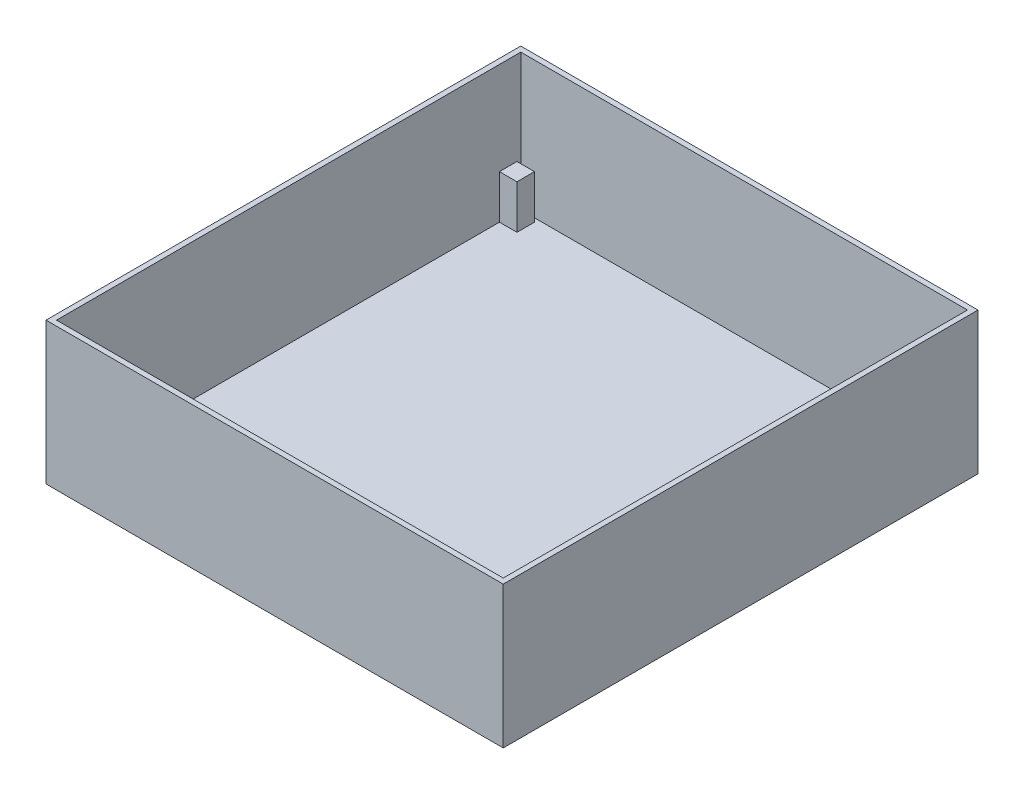
ISO-10303-21;
HEADER;
FILE_DESCRIPTION(('STEP AP214'),'2;1');
FILE_NAME('part.step','',(''),(''),'','','');
FILE_SCHEMA(('AUTOMOTIVE_DESIGN { 1 0 10303 214 1 1 1 1 }'));
ENDSEC;
DATA;
#1=APPLICATION_CONTEXT('core data for automotive mechanical design processes');
#2=APPLICATION_PROTOCOL_DEFINITION('international standard','automotive_design',2000,#1);
#3=PRODUCT_CONTEXT('',#1,'mechanical');
#4=PRODUCT('Part','Part','',(#3));
#5=PRODUCT_RELATED_PRODUCT_CATEGORY('part','',(#4));
#6=PRODUCT_DEFINITION_FORMATION('','',#4);
#7=PRODUCT_DEFINITION_CONTEXT('part definition',#1,'design');
#8=PRODUCT_DEFINITION('design','',#6,#7);
#9=PRODUCT_DEFINITION_SHAPE('','',#8);
#10=(LENGTH_UNIT() NAMED_UNIT(*) SI_UNIT(.MILLI.,.METRE.));
#11=(NAMED_UNIT(*) PLANE_ANGLE_UNIT() SI_UNIT($,.RADIAN.));
#12=(NAMED_UNIT(*) SI_UNIT($,.STERADIAN.) SOLID_ANGLE_UNIT());
#13=UNCERTAINTY_MEASURE_WITH_UNIT(LENGTH_MEASURE(1.E-05),#10,'distance_accuracy_value','');
#14=(GEOMETRIC_REPRESENTATION_CONTEXT(3) GLOBAL_UNCERTAINTY_ASSIGNED_CONTEXT((#13)) GLOBAL_UNIT_ASSIGNED_CONTEXT((#10,
#11,#12)) REPRESENTATION_CONTEXT('',''));
#15=CARTESIAN_POINT('',(0.,0.,0.));
#16=DIRECTION('',(0.,0.,1.));
#17=DIRECTION('',(1.,0.,0.));
#18=AXIS2_PLACEMENT_3D('',#15,#16,#17);
#19=CARTESIAN_POINT('',(0.,1.2,0.));
#20=DIRECTION('',(0.,1.,0.));
#21=DIRECTION('',(0.,0.,1.));
#22=AXIS2_PLACEMENT_3D('',#19,#20,#21);
#23=PLANE('',#22);
#24=DIRECTION('',(0.,0.,-1.));
#25=VECTOR('',#24,1.);
#26=CARTESIAN_POINT('',(-47.,1.2,-52.1305720631582));
#27=LINE('',#26,#25);
#28=CARTESIAN_POINT('',(-47.,1.2,-48.1305720631582));
#29=VERTEX_POINT('',#28);
#30=CARTESIAN_POINT('',(-47.,1.2,-52.1305720631582));
#31=VERTEX_POINT('',#30);
#32=EDGE_CURVE('E571',#29,#31,#27,.T.);
#33=ORIENTED_EDGE('',*,*,#32,.F.);
#34=DIRECTION('',(1.,0.,0.));
#35=VECTOR('',#34,1.);
#36=CARTESIAN_POINT('',(-51.,1.2,-48.1305720631582));
#37=LINE('',#36,#35);
#38=CARTESIAN_POINT('',(-51.,1.2,-48.1305720631582));
#39=VERTEX_POINT('',#38);
#40=EDGE_CURVE('E610',#39,#29,#37,.T.);
#41=ORIENTED_EDGE('',*,*,#40,.F.);
#42=DIRECTION('',(0.,0.,1.));
#43=VECTOR('',#42,1.);
#44=CARTESIAN_POINT('',(-51.,1.2,53.));
#45=LINE('',#44,#43);
#46=CARTESIAN_POINT('',(-51.,1.2,49.));
#47=VERTEX_POINT('',#46);
#48=EDGE_CURVE('E204',#39,#47,#45,.T.);
#49=ORIENTED_EDGE('',*,*,#48,.T.);
#50=DIRECTION('',(-1.,0.,0.));
#51=VECTOR('',#50,1.);
#52=CARTESIAN_POINT('',(-51.,1.2,49.));
#53=LINE('',#52,#51);
#54=CARTESIAN_POINT('',(-47.,1.2,49.));
#55=VERTEX_POINT('',#54);
#56=EDGE_CURVE('E62',#55,#47,#53,.T.);
#57=ORIENTED_EDGE('',*,*,#56,.F.);
#58=DIRECTION('',(0.,0.,-1.));
#59=VECTOR('',#58,1.);
#60=CARTESIAN_POINT('',(-47.,1.2,53.));
#61=LINE('',#60,#59);
#62=CARTESIAN_POINT('',(-47.,1.2,53.));
#63=VERTEX_POINT('',#62);
#64=EDGE_CURVE('E205',#63,#55,#61,.T.);
#65=ORIENTED_EDGE('',*,*,#64,.F.);
#66=DIRECTION('',(1.,0.,0.));
#67=VECTOR('',#66,1.);
#68=CARTESIAN_POINT('',(51.,1.2,53.));
#69=LINE('',#68,#67);
#70=CARTESIAN_POINT('',(48.,1.2,53.));
#71=VERTEX_POINT('',#70);
#72=EDGE_CURVE('E278',#63,#71,#69,.T.);
#73=ORIENTED_EDGE('',*,*,#72,.T.);
#74=DIRECTION('',(0.,0.,-1.));
#75=VECTOR('',#74,1.);
#76=CARTESIAN_POINT('',(48.,1.2,0.));
#77=LINE('',#76,#75);
#78=CARTESIAN_POINT('',(48.,1.2,50.));
#79=VERTEX_POINT('',#78);
#80=EDGE_CURVE('E252',#71,#79,#77,.T.);
#81=ORIENTED_EDGE('',*,*,#80,.T.);
#82=DIRECTION('',(-1.,0.,0.));
#83=VECTOR('',#82,1.);
#84=CARTESIAN_POINT('',(0.,1.2,50.));
#85=LINE('',#84,#83);
#86=CARTESIAN_POINT('',(51.,1.2,50.));
#87=VERTEX_POINT('',#86);
#88=EDGE_CURVE('E257',#87,#79,#85,.T.);
#89=ORIENTED_EDGE('',*,*,#88,.F.);
#90=DIRECTION('',(0.,0.,-1.));
#91=VECTOR('',#90,1.);
#92=CARTESIAN_POINT('',(51.,1.2,53.));
#93=LINE('',#92,#91);
#94=CARTESIAN_POINT('',(51.,1.2,-49.));
#95=VERTEX_POINT('',#94);
#96=EDGE_CURVE('E280',#87,#95,#93,.T.);
#97=ORIENTED_EDGE('',*,*,#96,.T.);
#98=DIRECTION('',(1.,0.,0.));
#99=VECTOR('',#98,1.);
#100=CARTESIAN_POINT('',(51.,1.2,-49.));
#101=LINE('',#100,#99);
#102=CARTESIAN_POINT('',(47.,1.2,-49.));
#103=VERTEX_POINT('',#102);
#104=EDGE_CURVE('E236',#103,#95,#101,.T.);
#105=ORIENTED_EDGE('',*,*,#104,.F.);
#106=DIRECTION('',(0.,0.,1.));
#107=VECTOR('',#106,1.);
#108=CARTESIAN_POINT('',(47.,1.2,-53.));
#109=LINE('',#108,#107);
#110=CARTESIAN_POINT('',(47.,1.2,-53.));
#111=VERTEX_POINT('',#110);
#112=EDGE_CURVE('E232',#111,#103,#109,.T.);
#113=ORIENTED_EDGE('',*,*,#112,.F.);
#114=DIRECTION('',(-1.,0.,0.));
#115=VECTOR('',#114,1.);
#116=CARTESIAN_POINT('',(51.,1.2,-53.));
#117=LINE('',#116,#115);
#118=CARTESIAN_POINT('',(-51.,1.2,-53.));
#119=VERTEX_POINT('',#118);
#120=EDGE_CURVE('E283',#111,#119,#117,.T.);
#121=ORIENTED_EDGE('',*,*,#120,.T.);
#122=CARTESIAN_POINT('',(-51.,1.2,-52.1305720631582));
#123=VERTEX_POINT('',#122);
#124=EDGE_CURVE('E275',#119,#123,#45,.T.);
#125=ORIENTED_EDGE('',*,*,#124,.T.);
#126=DIRECTION('',(-1.,0.,0.));
#127=VECTOR('',#126,1.);
#128=CARTESIAN_POINT('',(-51.,1.2,-52.1305720631582));
#129=LINE('',#128,#127);
#130=EDGE_CURVE('E199',#31,#123,#129,.T.);
#131=ORIENTED_EDGE('',*,*,#130,.F.);
#132=EDGE_LOOP('',(#33,#41,#49,#57,#65,#73,#81,#89,#97,#105,#113,#121,#125,#131));
#133=FACE_BOUND('',#132,.T.);
#134=ADVANCED_FACE('F39',(#133),#23,.T.);
#135=CARTESIAN_POINT('',(-51.,1.2,53.));
#136=DIRECTION('',(-1.,0.,0.));
#137=DIRECTION('',(0.,0.,1.));
#138=AXIS2_PLACEMENT_3D('',#135,#136,#137);
#139=PLANE('',#138);
#140=DIRECTION('',(0.,-1.,0.));
#141=VECTOR('',#140,1.);
#142=CARTESIAN_POINT('',(-51.,11.2,-48.1305720631582));
#143=LINE('',#142,#141);
#144=CARTESIAN_POINT('',(-51.,11.2,-48.1305720631582));
#145=VERTEX_POINT('',#144);
#146=EDGE_CURVE('E186',#145,#39,#143,.T.);
#147=ORIENTED_EDGE('',*,*,#146,.F.);
#148=DIRECTION('',(0.,0.,1.));
#149=VECTOR('',#148,1.);
#150=CARTESIAN_POINT('',(-51.,11.2,-52.1305720631582));
#151=LINE('',#150,#149);
#152=CARTESIAN_POINT('',(-51.,11.2,-52.1305720631582));
#153=VERTEX_POINT('',#152);
#154=EDGE_CURVE('E193',#153,#145,#151,.T.);
#155=ORIENTED_EDGE('',*,*,#154,.F.);
#156=DIRECTION('',(0.,-1.,0.));
#157=VECTOR('',#156,1.);
#158=CARTESIAN_POINT('',(-51.,11.2,-52.1305720631582));
#159=LINE('',#158,#157);
#160=EDGE_CURVE('E54',#153,#123,#159,.T.);
#161=ORIENTED_EDGE('',*,*,#160,.T.);
#162=ORIENTED_EDGE('',*,*,#124,.F.);
#163=DIRECTION('',(0.,1.,0.));
#164=VECTOR('',#163,1.);
#165=CARTESIAN_POINT('',(-51.,1.2,-53.));
#166=LINE('',#165,#164);
#167=CARTESIAN_POINT('',(-51.,32.4,-53.));
#168=VERTEX_POINT('',#167);
#169=EDGE_CURVE('E297',#119,#168,#166,.T.);
#170=ORIENTED_EDGE('',*,*,#169,.T.);
#171=DIRECTION('',(0.,0.,1.));
#172=VECTOR('',#171,1.);
#173=CARTESIAN_POINT('',(-51.,32.4,53.));
#174=LINE('',#173,#172);
#175=CARTESIAN_POINT('',(-51.,32.4,53.));
#176=VERTEX_POINT('',#175);
#177=EDGE_CURVE('E274',#168,#176,#174,.T.);
#178=ORIENTED_EDGE('',*,*,#177,.T.);
#179=DIRECTION('',(0.,1.,0.));
#180=VECTOR('',#179,1.);
#181=CARTESIAN_POINT('',(-51.,1.2,53.));
#182=LINE('',#181,#180);
#183=CARTESIAN_POINT('',(-51.,11.2,53.));
#184=VERTEX_POINT('',#183);
#185=EDGE_CURVE('E285',#184,#176,#182,.T.);
#186=ORIENTED_EDGE('',*,*,#185,.F.);
#187=DIRECTION('',(0.,0.,1.));
#188=VECTOR('',#187,1.);
#189=CARTESIAN_POINT('',(-51.,11.2,53.));
#190=LINE('',#189,#188);
#191=CARTESIAN_POINT('',(-51.,11.2,49.));
#192=VERTEX_POINT('',#191);
#193=EDGE_CURVE('E212',#192,#184,#190,.T.);
#194=ORIENTED_EDGE('',*,*,#193,.F.);
#195=DIRECTION('',(0.,-1.,0.));
#196=VECTOR('',#195,1.);
#197=CARTESIAN_POINT('',(-51.,11.2,49.));
#198=LINE('',#197,#196);
#199=EDGE_CURVE('E222',#192,#47,#198,.T.);
#200=ORIENTED_EDGE('',*,*,#199,.T.);
#201=ORIENTED_EDGE('',*,*,#48,.F.);
#202=EDGE_LOOP('',(#147,#155,#161,#162,#170,#178,#186,#194,#200,#201));
#203=FACE_BOUND('',#202,.T.);
#204=ADVANCED_FACE('F202',(#203),#139,.F.);
#205=CARTESIAN_POINT('',(51.,1.2,53.));
#206=DIRECTION('',(0.,0.,1.));
#207=DIRECTION('',(1.,0.,0.));
#208=AXIS2_PLACEMENT_3D('',#205,#206,#207);
#209=PLANE('',#208);
#210=DIRECTION('',(0.,-1.,0.));
#211=VECTOR('',#210,1.);
#212=CARTESIAN_POINT('',(-47.,11.2,53.));
#213=LINE('',#212,#211);
#214=CARTESIAN_POINT('',(-47.,11.2,53.));
#215=VERTEX_POINT('',#214);
#216=EDGE_CURVE('E229',#215,#63,#213,.T.);
#217=ORIENTED_EDGE('',*,*,#216,.F.);
#218=DIRECTION('',(1.,0.,0.));
#219=VECTOR('',#218,1.);
#220=CARTESIAN_POINT('',(-51.,11.2,53.));
#221=LINE('',#220,#219);
#222=EDGE_CURVE('E215',#184,#215,#221,.T.);
#223=ORIENTED_EDGE('',*,*,#222,.F.);
#224=ORIENTED_EDGE('',*,*,#185,.T.);
#225=DIRECTION('',(1.,0.,0.));
#226=VECTOR('',#225,1.);
#227=CARTESIAN_POINT('',(51.,32.4,53.));
#228=LINE('',#227,#226);
#229=CARTESIAN_POINT('',(51.,32.4,53.));
#230=VERTEX_POINT('',#229);
#231=EDGE_CURVE('E288',#176,#230,#228,.T.);
#232=ORIENTED_EDGE('',*,*,#231,.T.);
#233=DIRECTION('',(0.,1.,0.));
#234=VECTOR('',#233,1.);
#235=CARTESIAN_POINT('',(51.,1.2,53.));
#236=LINE('',#235,#234);
#237=CARTESIAN_POINT('',(51.,11.2,53.));
#238=VERTEX_POINT('',#237);
#239=EDGE_CURVE('E302',#238,#230,#236,.T.);
#240=ORIENTED_EDGE('',*,*,#239,.F.);
#241=DIRECTION('',(1.,0.,0.));
#242=VECTOR('',#241,1.);
#243=CARTESIAN_POINT('',(0.,11.2,53.));
#244=LINE('',#243,#242);
#245=CARTESIAN_POINT('',(48.,11.2,53.));
#246=VERTEX_POINT('',#245);
#247=EDGE_CURVE('E256',#246,#238,#244,.T.);
#248=ORIENTED_EDGE('',*,*,#247,.F.);
#249=DIRECTION('',(0.,-1.,0.));
#250=VECTOR('',#249,1.);
#251=CARTESIAN_POINT('',(48.,11.2,53.));
#252=LINE('',#251,#250);
#253=EDGE_CURVE('E271',#246,#71,#252,.T.);
#254=ORIENTED_EDGE('',*,*,#253,.T.);
#255=ORIENTED_EDGE('',*,*,#72,.F.);
#256=EDGE_LOOP('',(#217,#223,#224,#232,#240,#248,#254,#255));
#257=FACE_BOUND('',#256,.T.);
#258=ADVANCED_FACE('F361',(#257),#209,.F.);
#259=CARTESIAN_POINT('',(51.,1.2,53.));
#260=DIRECTION('',(1.,0.,0.));
#261=DIRECTION('',(0.,0.,-1.));
#262=AXIS2_PLACEMENT_3D('',#259,#260,#261);
#263=PLANE('',#262);
#264=DIRECTION('',(0.,-1.,0.));
#265=VECTOR('',#264,1.);
#266=CARTESIAN_POINT('',(51.,11.2,-49.));
#267=LINE('',#266,#265);
#268=CARTESIAN_POINT('',(51.,11.2,-49.));
#269=VERTEX_POINT('',#268);
#270=EDGE_CURVE('E242',#269,#95,#267,.T.);
#271=ORIENTED_EDGE('',*,*,#270,.T.);
#272=ORIENTED_EDGE('',*,*,#96,.F.);
#273=DIRECTION('',(0.,-1.,0.));
#274=VECTOR('',#273,1.);
#275=CARTESIAN_POINT('',(51.,11.2,50.));
#276=LINE('',#275,#274);
#277=CARTESIAN_POINT('',(51.,11.2,50.));
#278=VERTEX_POINT('',#277);
#279=EDGE_CURVE('E269',#278,#87,#276,.T.);
#280=ORIENTED_EDGE('',*,*,#279,.F.);
#281=DIRECTION('',(0.,0.,-1.));
#282=VECTOR('',#281,1.);
#283=CARTESIAN_POINT('',(51.,11.2,0.));
#284=LINE('',#283,#282);
#285=EDGE_CURVE('E259',#238,#278,#284,.T.);
#286=ORIENTED_EDGE('',*,*,#285,.F.);
#287=ORIENTED_EDGE('',*,*,#239,.T.);
#288=DIRECTION('',(0.,0.,-1.));
#289=VECTOR('',#288,1.);
#290=CARTESIAN_POINT('',(51.,32.4,53.));
#291=LINE('',#290,#289);
#292=CARTESIAN_POINT('',(51.,32.4,-53.));
#293=VERTEX_POINT('',#292);
#294=EDGE_CURVE('E291',#230,#293,#291,.T.);
#295=ORIENTED_EDGE('',*,*,#294,.T.);
#296=DIRECTION('',(0.,1.,0.));
#297=VECTOR('',#296,1.);
#298=CARTESIAN_POINT('',(51.,1.2,-53.));
#299=LINE('',#298,#297);
#300=CARTESIAN_POINT('',(51.,11.2,-53.));
#301=VERTEX_POINT('',#300);
#302=EDGE_CURVE('E300',#301,#293,#299,.T.);
#303=ORIENTED_EDGE('',*,*,#302,.F.);
#304=DIRECTION('',(0.,0.,-1.));
#305=VECTOR('',#304,1.);
#306=CARTESIAN_POINT('',(51.,11.2,-53.));
#307=LINE('',#306,#305);
#308=EDGE_CURVE('E233',#269,#301,#307,.T.);
#309=ORIENTED_EDGE('',*,*,#308,.F.);
#310=EDGE_LOOP('',(#271,#272,#280,#286,#287,#295,#303,#309));
#311=FACE_BOUND('',#310,.T.);
#312=ADVANCED_FACE('F370',(#311),#263,.F.);
#313=CARTESIAN_POINT('',(51.,1.2,-53.));
#314=DIRECTION('',(0.,0.,-1.));
#315=DIRECTION('',(-1.,0.,0.));
#316=AXIS2_PLACEMENT_3D('',#313,#314,#315);
#317=PLANE('',#316);
#318=DIRECTION('',(0.,-1.,0.));
#319=VECTOR('',#318,1.);
#320=CARTESIAN_POINT('',(47.,11.2,-53.));
#321=LINE('',#320,#319);
#322=CARTESIAN_POINT('',(47.,11.2,-53.));
#323=VERTEX_POINT('',#322);
#324=EDGE_CURVE('E250',#323,#111,#321,.T.);
#325=ORIENTED_EDGE('',*,*,#324,.F.);
#326=DIRECTION('',(-1.,0.,0.));
#327=VECTOR('',#326,1.);
#328=CARTESIAN_POINT('',(51.,11.2,-53.));
#329=LINE('',#328,#327);
#330=EDGE_CURVE('E235',#301,#323,#329,.T.);
#331=ORIENTED_EDGE('',*,*,#330,.F.);
#332=ORIENTED_EDGE('',*,*,#302,.T.);
#333=DIRECTION('',(-1.,0.,0.));
#334=VECTOR('',#333,1.);
#335=CARTESIAN_POINT('',(51.,32.4,-53.));
#336=LINE('',#335,#334);
#337=EDGE_CURVE('E294',#293,#168,#336,.T.);
#338=ORIENTED_EDGE('',*,*,#337,.T.);
#339=ORIENTED_EDGE('',*,*,#169,.F.);
#340=ORIENTED_EDGE('',*,*,#120,.F.);
#341=EDGE_LOOP('',(#325,#331,#332,#338,#339,#340));
#342=FACE_BOUND('',#341,.T.);
#343=ADVANCED_FACE('F355',(#342),#317,.F.);
#344=CARTESIAN_POINT('',(-52.2,32.4,-54.2));
#345=DIRECTION('',(1.,0.,0.));
#346=DIRECTION('',(0.,0.,-1.));
#347=AXIS2_PLACEMENT_3D('',#344,#345,#346);
#348=PLANE('',#347);
#349=DIRECTION('',(0.,0.,1.));
#350=VECTOR('',#349,1.);
#351=CARTESIAN_POINT('',(-52.2,0.,-54.2));
#352=LINE('',#351,#350);
#353=CARTESIAN_POINT('',(-52.2,0.,-54.2));
#354=VERTEX_POINT('',#353);
#355=CARTESIAN_POINT('',(-52.2,0.,54.2));
#356=VERTEX_POINT('',#355);
#357=EDGE_CURVE('E299',#354,#356,#352,.T.);
#358=ORIENTED_EDGE('',*,*,#357,.T.);
#359=DIRECTION('',(0.,-1.,0.));
#360=VECTOR('',#359,1.);
#361=CARTESIAN_POINT('',(-52.2,32.4,54.2));
#362=LINE('',#361,#360);
#363=CARTESIAN_POINT('',(-52.2,32.4,54.2));
#364=VERTEX_POINT('',#363);
#365=EDGE_CURVE('E11',#364,#356,#362,.T.);
#366=ORIENTED_EDGE('',*,*,#365,.F.);
#367=DIRECTION('',(0.,0.,1.));
#368=VECTOR('',#367,1.);
#369=CARTESIAN_POINT('',(-52.2,32.4,-54.2));
#370=LINE('',#369,#368);
#371=CARTESIAN_POINT('',(-52.2,32.4,-54.2));
#372=VERTEX_POINT('',#371);
#373=EDGE_CURVE('E305',#372,#364,#370,.T.);
#374=ORIENTED_EDGE('',*,*,#373,.F.);
#375=DIRECTION('',(0.,-1.,0.));
#376=VECTOR('',#375,1.);
#377=CARTESIAN_POINT('',(-52.2,32.4,-54.2));
#378=LINE('',#377,#376);
#379=EDGE_CURVE('E315',#372,#354,#378,.T.);
#380=ORIENTED_EDGE('',*,*,#379,.T.);
#381=EDGE_LOOP('',(#358,#366,#374,#380));
#382=FACE_BOUND('',#381,.T.);
#383=ADVANCED_FACE('F41',(#382),#348,.F.);
#384=CARTESIAN_POINT('',(52.2,32.4,54.2));
#385=DIRECTION('',(0.,0.,-1.));
#386=DIRECTION('',(-1.,0.,0.));
#387=AXIS2_PLACEMENT_3D('',#384,#385,#386);
#388=PLANE('',#387);
#389=DIRECTION('',(1.,0.,0.));
#390=VECTOR('',#389,1.);
#391=CARTESIAN_POINT('',(52.2,0.,54.2));
#392=LINE('',#391,#390);
#393=CARTESIAN_POINT('',(52.2,0.,54.2));
#394=VERTEX_POINT('',#393);
#395=EDGE_CURVE('E318',#356,#394,#392,.T.);
#396=ORIENTED_EDGE('',*,*,#395,.T.);
#397=DIRECTION('',(0.,-1.,0.));
#398=VECTOR('',#397,1.);
#399=CARTESIAN_POINT('',(52.2,32.4,54.2));
#400=LINE('',#399,#398);
#401=CARTESIAN_POINT('',(52.2,32.4,54.2));
#402=VERTEX_POINT('',#401);
#403=EDGE_CURVE('E47',#402,#394,#400,.T.);
#404=ORIENTED_EDGE('',*,*,#403,.F.);
#405=DIRECTION('',(1.,0.,0.));
#406=VECTOR('',#405,1.);
#407=CARTESIAN_POINT('',(52.2,32.4,54.2));
#408=LINE('',#407,#406);
#409=EDGE_CURVE('E308',#364,#402,#408,.T.);
#410=ORIENTED_EDGE('',*,*,#409,.F.);
#411=ORIENTED_EDGE('',*,*,#365,.T.);
#412=EDGE_LOOP('',(#396,#404,#410,#411));
#413=FACE_BOUND('',#412,.T.);
#414=ADVANCED_FACE('F348',(#413),#388,.F.);
#415=CARTESIAN_POINT('',(52.2,32.4,-54.2));
#416=DIRECTION('',(-1.,0.,0.));
#417=DIRECTION('',(0.,0.,1.));
#418=AXIS2_PLACEMENT_3D('',#415,#416,#417);
#419=PLANE('',#418);
#420=DIRECTION('',(0.,0.,-1.));
#421=VECTOR('',#420,1.);
#422=CARTESIAN_POINT('',(52.2,0.,-54.2));
#423=LINE('',#422,#421);
#424=CARTESIAN_POINT('',(52.2,0.,-54.2));
#425=VERTEX_POINT('',#424);
#426=EDGE_CURVE('E320',#394,#425,#423,.T.);
#427=ORIENTED_EDGE('',*,*,#426,.T.);
#428=DIRECTION('',(0.,-1.,0.));
#429=VECTOR('',#428,1.);
#430=CARTESIAN_POINT('',(52.2,32.4,-54.2));
#431=LINE('',#430,#429);
#432=CARTESIAN_POINT('',(52.2,32.4,-54.2));
#433=VERTEX_POINT('',#432);
#434=EDGE_CURVE('E325',#433,#425,#431,.T.);
#435=ORIENTED_EDGE('',*,*,#434,.F.);
#436=DIRECTION('',(0.,0.,-1.));
#437=VECTOR('',#436,1.);
#438=CARTESIAN_POINT('',(52.2,32.4,-54.2));
#439=LINE('',#438,#437);
#440=EDGE_CURVE('E311',#402,#433,#439,.T.);
#441=ORIENTED_EDGE('',*,*,#440,.F.);
#442=ORIENTED_EDGE('',*,*,#403,.T.);
#443=EDGE_LOOP('',(#427,#435,#441,#442));
#444=FACE_BOUND('',#443,.T.);
#445=ADVANCED_FACE('F332',(#444),#419,.F.);
#446=CARTESIAN_POINT('',(52.2,32.4,-54.2));
#447=DIRECTION('',(0.,0.,1.));
#448=DIRECTION('',(1.,0.,0.));
#449=AXIS2_PLACEMENT_3D('',#446,#447,#448);
#450=PLANE('',#449);
#451=DIRECTION('',(-1.,0.,0.));
#452=VECTOR('',#451,1.);
#453=CARTESIAN_POINT('',(52.2,0.,-54.2));
#454=LINE('',#453,#452);
#455=EDGE_CURVE('E309',#425,#354,#454,.T.);
#456=ORIENTED_EDGE('',*,*,#455,.T.);
#457=ORIENTED_EDGE('',*,*,#379,.F.);
#458=DIRECTION('',(-1.,0.,0.));
#459=VECTOR('',#458,1.);
#460=CARTESIAN_POINT('',(52.2,32.4,-54.2));
#461=LINE('',#460,#459);
#462=EDGE_CURVE('E313',#433,#372,#461,.T.);
#463=ORIENTED_EDGE('',*,*,#462,.F.);
#464=ORIENTED_EDGE('',*,*,#434,.T.);
#465=EDGE_LOOP('',(#456,#457,#463,#464));
#466=FACE_BOUND('',#465,.T.);
#467=ADVANCED_FACE('F341',(#466),#450,.F.);
#468=CARTESIAN_POINT('',(0.,32.4,0.));
#469=DIRECTION('',(0.,-1.,0.));
#470=DIRECTION('',(0.,0.,-1.));
#471=AXIS2_PLACEMENT_3D('',#468,#469,#470);
#472=PLANE('',#471);
#473=ORIENTED_EDGE('',*,*,#231,.F.);
#474=ORIENTED_EDGE('',*,*,#177,.F.);
#475=ORIENTED_EDGE('',*,*,#337,.F.);
#476=ORIENTED_EDGE('',*,*,#294,.F.);
#477=EDGE_LOOP('',(#473,#474,#475,#476));
#478=FACE_BOUND('',#477,.T.);
#479=ORIENTED_EDGE('',*,*,#373,.T.);
#480=ORIENTED_EDGE('',*,*,#409,.T.);
#481=ORIENTED_EDGE('',*,*,#440,.T.);
#482=ORIENTED_EDGE('',*,*,#462,.T.);
#483=EDGE_LOOP('',(#479,#480,#481,#482));
#484=FACE_BOUND('',#483,.T.);
#485=ADVANCED_FACE('F347',(#478,#484),#472,.F.);
#486=CARTESIAN_POINT('',(0.,0.,0.));
#487=DIRECTION('',(0.,-1.,0.));
#488=DIRECTION('',(0.,0.,-1.));
#489=AXIS2_PLACEMENT_3D('',#486,#487,#488);
#490=PLANE('',#489);
#491=ORIENTED_EDGE('',*,*,#357,.F.);
#492=ORIENTED_EDGE('',*,*,#455,.F.);
#493=ORIENTED_EDGE('',*,*,#426,.F.);
#494=ORIENTED_EDGE('',*,*,#395,.F.);
#495=EDGE_LOOP('',(#491,#492,#493,#494));
#496=FACE_BOUND('',#495,.T.);
#497=ADVANCED_FACE('F338',(#496),#490,.T.);
#498=CARTESIAN_POINT('',(48.,11.2,0.));
#499=DIRECTION('',(-1.,0.,0.));
#500=DIRECTION('',(0.,0.,1.));
#501=AXIS2_PLACEMENT_3D('',#498,#499,#500);
#502=PLANE('',#501);
#503=ORIENTED_EDGE('',*,*,#80,.F.);
#504=ORIENTED_EDGE('',*,*,#253,.F.);
#505=DIRECTION('',(0.,0.,-1.));
#506=VECTOR('',#505,1.);
#507=CARTESIAN_POINT('',(48.,11.2,0.));
#508=LINE('',#507,#506);
#509=CARTESIAN_POINT('',(48.,11.2,50.));
#510=VERTEX_POINT('',#509);
#511=EDGE_CURVE('E253',#246,#510,#508,.T.);
#512=ORIENTED_EDGE('',*,*,#511,.T.);
#513=DIRECTION('',(0.,-1.,0.));
#514=VECTOR('',#513,1.);
#515=CARTESIAN_POINT('',(48.,11.2,50.));
#516=LINE('',#515,#514);
#517=EDGE_CURVE('E263',#510,#79,#516,.T.);
#518=ORIENTED_EDGE('',*,*,#517,.T.);
#519=EDGE_LOOP('',(#503,#504,#512,#518));
#520=FACE_BOUND('',#519,.T.);
#521=ADVANCED_FACE('F366',(#520),#502,.T.);
#522=CARTESIAN_POINT('',(0.,11.2,50.));
#523=DIRECTION('',(0.,0.,1.));
#524=DIRECTION('',(1.,0.,0.));
#525=AXIS2_PLACEMENT_3D('',#522,#523,#524);
#526=PLANE('',#525);
#527=ORIENTED_EDGE('',*,*,#88,.T.);
#528=ORIENTED_EDGE('',*,*,#517,.F.);
#529=DIRECTION('',(-1.,0.,0.));
#530=VECTOR('',#529,1.);
#531=CARTESIAN_POINT('',(0.,11.2,50.));
#532=LINE('',#531,#530);
#533=EDGE_CURVE('E261',#278,#510,#532,.T.);
#534=ORIENTED_EDGE('',*,*,#533,.F.);
#535=ORIENTED_EDGE('',*,*,#279,.T.);
#536=EDGE_LOOP('',(#527,#528,#534,#535));
#537=FACE_BOUND('',#536,.T.);
#538=ADVANCED_FACE('F402',(#537),#526,.F.);
#539=CARTESIAN_POINT('',(0.,11.2,0.));
#540=DIRECTION('',(0.,1.,0.));
#541=DIRECTION('',(0.,0.,1.));
#542=AXIS2_PLACEMENT_3D('',#539,#540,#541);
#543=PLANE('',#542);
#544=ORIENTED_EDGE('',*,*,#511,.F.);
#545=ORIENTED_EDGE('',*,*,#247,.T.);
#546=ORIENTED_EDGE('',*,*,#285,.T.);
#547=ORIENTED_EDGE('',*,*,#533,.T.);
#548=EDGE_LOOP('',(#544,#545,#546,#547));
#549=FACE_BOUND('',#548,.T.);
#550=ADVANCED_FACE('F409',(#549),#543,.T.);
#551=CARTESIAN_POINT('',(47.,11.2,-53.));
#552=DIRECTION('',(1.,0.,0.));
#553=DIRECTION('',(0.,0.,-1.));
#554=AXIS2_PLACEMENT_3D('',#551,#552,#553);
#555=PLANE('',#554);
#556=ORIENTED_EDGE('',*,*,#112,.T.);
#557=DIRECTION('',(0.,-1.,0.));
#558=VECTOR('',#557,1.);
#559=CARTESIAN_POINT('',(47.,11.2,-49.));
#560=LINE('',#559,#558);
#561=CARTESIAN_POINT('',(47.,11.2,-49.));
#562=VERTEX_POINT('',#561);
#563=EDGE_CURVE('E248',#562,#103,#560,.T.);
#564=ORIENTED_EDGE('',*,*,#563,.F.);
#565=DIRECTION('',(0.,0.,1.));
#566=VECTOR('',#565,1.);
#567=CARTESIAN_POINT('',(47.,11.2,-53.));
#568=LINE('',#567,#566);
#569=EDGE_CURVE('E238',#323,#562,#568,.T.);
#570=ORIENTED_EDGE('',*,*,#569,.F.);
#571=ORIENTED_EDGE('',*,*,#324,.T.);
#572=EDGE_LOOP('',(#556,#564,#570,#571));
#573=FACE_BOUND('',#572,.T.);
#574=ADVANCED_FACE('F416',(#573),#555,.F.);
#575=CARTESIAN_POINT('',(51.,11.2,-49.));
#576=DIRECTION('',(0.,0.,-1.));
#577=DIRECTION('',(-1.,0.,0.));
#578=AXIS2_PLACEMENT_3D('',#575,#576,#577);
#579=PLANE('',#578);
#580=ORIENTED_EDGE('',*,*,#104,.T.);
#581=ORIENTED_EDGE('',*,*,#270,.F.);
#582=DIRECTION('',(1.,0.,0.));
#583=VECTOR('',#582,1.);
#584=CARTESIAN_POINT('',(51.,11.2,-49.));
#585=LINE('',#584,#583);
#586=EDGE_CURVE('E240',#562,#269,#585,.T.);
#587=ORIENTED_EDGE('',*,*,#586,.F.);
#588=ORIENTED_EDGE('',*,*,#563,.T.);
#589=EDGE_LOOP('',(#580,#581,#587,#588));
#590=FACE_BOUND('',#589,.T.);
#591=ADVANCED_FACE('F425',(#590),#579,.F.);
#592=CARTESIAN_POINT('',(0.,11.2,0.));
#593=DIRECTION('',(0.,-1.,0.));
#594=DIRECTION('',(0.,0.,-1.));
#595=AXIS2_PLACEMENT_3D('',#592,#593,#594);
#596=PLANE('',#595);
#597=ORIENTED_EDGE('',*,*,#308,.T.);
#598=ORIENTED_EDGE('',*,*,#330,.T.);
#599=ORIENTED_EDGE('',*,*,#569,.T.);
#600=ORIENTED_EDGE('',*,*,#586,.T.);
#601=EDGE_LOOP('',(#597,#598,#599,#600));
#602=FACE_BOUND('',#601,.T.);
#603=ADVANCED_FACE('F434',(#602),#596,.F.);
#604=CARTESIAN_POINT('',(-47.,11.2,53.));
#605=DIRECTION('',(-1.,0.,0.));
#606=DIRECTION('',(0.,0.,1.));
#607=AXIS2_PLACEMENT_3D('',#604,#605,#606);
#608=PLANE('',#607);
#609=ORIENTED_EDGE('',*,*,#64,.T.);
#610=DIRECTION('',(0.,-1.,0.));
#611=VECTOR('',#610,1.);
#612=CARTESIAN_POINT('',(-47.,11.2,49.));
#613=LINE('',#612,#611);
#614=CARTESIAN_POINT('',(-47.,11.2,49.));
#615=VERTEX_POINT('',#614);
#616=EDGE_CURVE('E226',#615,#55,#613,.T.);
#617=ORIENTED_EDGE('',*,*,#616,.F.);
#618=DIRECTION('',(0.,0.,-1.));
#619=VECTOR('',#618,1.);
#620=CARTESIAN_POINT('',(-47.,11.2,53.));
#621=LINE('',#620,#619);
#622=EDGE_CURVE('E218',#215,#615,#621,.T.);
#623=ORIENTED_EDGE('',*,*,#622,.F.);
#624=ORIENTED_EDGE('',*,*,#216,.T.);
#625=EDGE_LOOP('',(#609,#617,#623,#624));
#626=FACE_BOUND('',#625,.T.);
#627=ADVANCED_FACE('F442',(#626),#608,.F.);
#628=CARTESIAN_POINT('',(-51.,11.2,49.));
#629=DIRECTION('',(0.,0.,1.));
#630=DIRECTION('',(1.,0.,0.));
#631=AXIS2_PLACEMENT_3D('',#628,#629,#630);
#632=PLANE('',#631);
#633=ORIENTED_EDGE('',*,*,#56,.T.);
#634=ORIENTED_EDGE('',*,*,#199,.F.);
#635=DIRECTION('',(-1.,0.,0.));
#636=VECTOR('',#635,1.);
#637=CARTESIAN_POINT('',(-51.,11.2,49.));
#638=LINE('',#637,#636);
#639=EDGE_CURVE('E220',#615,#192,#638,.T.);
#640=ORIENTED_EDGE('',*,*,#639,.F.);
#641=ORIENTED_EDGE('',*,*,#616,.T.);
#642=EDGE_LOOP('',(#633,#634,#640,#641));
#643=FACE_BOUND('',#642,.T.);
#644=ADVANCED_FACE('F451',(#643),#632,.F.);
#645=CARTESIAN_POINT('',(0.,11.2,0.));
#646=DIRECTION('',(0.,-1.,0.));
#647=DIRECTION('',(0.,0.,-1.));
#648=AXIS2_PLACEMENT_3D('',#645,#646,#647);
#649=PLANE('',#648);
#650=ORIENTED_EDGE('',*,*,#193,.T.);
#651=ORIENTED_EDGE('',*,*,#222,.T.);
#652=ORIENTED_EDGE('',*,*,#622,.T.);
#653=ORIENTED_EDGE('',*,*,#639,.T.);
#654=EDGE_LOOP('',(#650,#651,#652,#653));
#655=FACE_BOUND('',#654,.T.);
#656=ADVANCED_FACE('F459',(#655),#649,.F.);
#657=CARTESIAN_POINT('',(-51.,11.2,-48.1305720631582));
#658=DIRECTION('',(0.,0.,-1.));
#659=DIRECTION('',(-1.,0.,0.));
#660=AXIS2_PLACEMENT_3D('',#657,#658,#659);
#661=PLANE('',#660);
#662=ORIENTED_EDGE('',*,*,#40,.T.);
#663=DIRECTION('',(0.,-1.,0.));
#664=VECTOR('',#663,1.);
#665=CARTESIAN_POINT('',(-47.,11.2,-48.1305720631582));
#666=LINE('',#665,#664);
#667=CARTESIAN_POINT('',(-47.,11.2,-48.1305720631582));
#668=VERTEX_POINT('',#667);
#669=EDGE_CURVE('E189',#668,#29,#666,.T.);
#670=ORIENTED_EDGE('',*,*,#669,.F.);
#671=DIRECTION('',(1.,0.,0.));
#672=VECTOR('',#671,1.);
#673=CARTESIAN_POINT('',(-51.,11.2,-48.1305720631582));
#674=LINE('',#673,#672);
#675=EDGE_CURVE('E182',#145,#668,#674,.T.);
#676=ORIENTED_EDGE('',*,*,#675,.F.);
#677=ORIENTED_EDGE('',*,*,#146,.T.);
#678=EDGE_LOOP('',(#662,#670,#676,#677));
#679=FACE_BOUND('',#678,.T.);
#680=ADVANCED_FACE('F184',(#679),#661,.F.);
#681=CARTESIAN_POINT('',(-47.,11.2,-52.1305720631582));
#682=DIRECTION('',(-1.,0.,0.));
#683=DIRECTION('',(0.,0.,1.));
#684=AXIS2_PLACEMENT_3D('',#681,#682,#683);
#685=PLANE('',#684);
#686=ORIENTED_EDGE('',*,*,#32,.T.);
#687=DIRECTION('',(0.,-1.,0.));
#688=VECTOR('',#687,1.);
#689=CARTESIAN_POINT('',(-47.,11.2,-52.1305720631582));
#690=LINE('',#689,#688);
#691=CARTESIAN_POINT('',(-47.,11.2,-52.1305720631582));
#692=VERTEX_POINT('',#691);
#693=EDGE_CURVE('E208',#692,#31,#690,.T.);
#694=ORIENTED_EDGE('',*,*,#693,.F.);
#695=DIRECTION('',(0.,0.,-1.));
#696=VECTOR('',#695,1.);
#697=CARTESIAN_POINT('',(-47.,11.2,-52.1305720631582));
#698=LINE('',#697,#696);
#699=EDGE_CURVE('E192',#668,#692,#698,.T.);
#700=ORIENTED_EDGE('',*,*,#699,.F.);
#701=ORIENTED_EDGE('',*,*,#669,.T.);
#702=EDGE_LOOP('',(#686,#694,#700,#701));
#703=FACE_BOUND('',#702,.T.);
#704=ADVANCED_FACE('F474',(#703),#685,.F.);
#705=CARTESIAN_POINT('',(-51.,11.2,-52.1305720631582));
#706=DIRECTION('',(0.,0.,1.));
#707=DIRECTION('',(1.,0.,0.));
#708=AXIS2_PLACEMENT_3D('',#705,#706,#707);
#709=PLANE('',#708);
#710=ORIENTED_EDGE('',*,*,#130,.T.);
#711=ORIENTED_EDGE('',*,*,#160,.F.);
#712=DIRECTION('',(-1.,0.,0.));
#713=VECTOR('',#712,1.);
#714=CARTESIAN_POINT('',(-51.,11.2,-52.1305720631582));
#715=LINE('',#714,#713);
#716=EDGE_CURVE('E197',#692,#153,#715,.T.);
#717=ORIENTED_EDGE('',*,*,#716,.F.);
#718=ORIENTED_EDGE('',*,*,#693,.T.);
#719=EDGE_LOOP('',(#710,#711,#717,#718));
#720=FACE_BOUND('',#719,.T.);
#721=ADVANCED_FACE('F482',(#720),#709,.F.);
#722=CARTESIAN_POINT('',(0.,11.2,0.));
#723=DIRECTION('',(0.,1.,0.));
#724=DIRECTION('',(0.,0.,1.));
#725=AXIS2_PLACEMENT_3D('',#722,#723,#724);
#726=PLANE('',#725);
#727=ORIENTED_EDGE('',*,*,#154,.T.);
#728=ORIENTED_EDGE('',*,*,#675,.T.);
#729=ORIENTED_EDGE('',*,*,#699,.T.);
#730=ORIENTED_EDGE('',*,*,#716,.T.);
#731=EDGE_LOOP('',(#727,#728,#729,#730));
#732=FACE_BOUND('',#731,.T.);
#733=ADVANCED_FACE('F196',(#732),#726,.T.);
#734=CLOSED_SHELL('',(#134,#204,#258,#312,#343,#383,#414,#445,#467,#485,#497,#521,#538,#550,
#574,#591,#603,#627,#644,#656,#680,#704,#721,#733));
#735=MANIFOLD_SOLID_BREP('B2',#734);
#736=ADVANCED_BREP_SHAPE_REPRESENTATION('',(#18,#735),#14);
#737=SHAPE_DEFINITION_REPRESENTATION(#9,#736);
ENDSEC;
END-ISO-10303-21;
